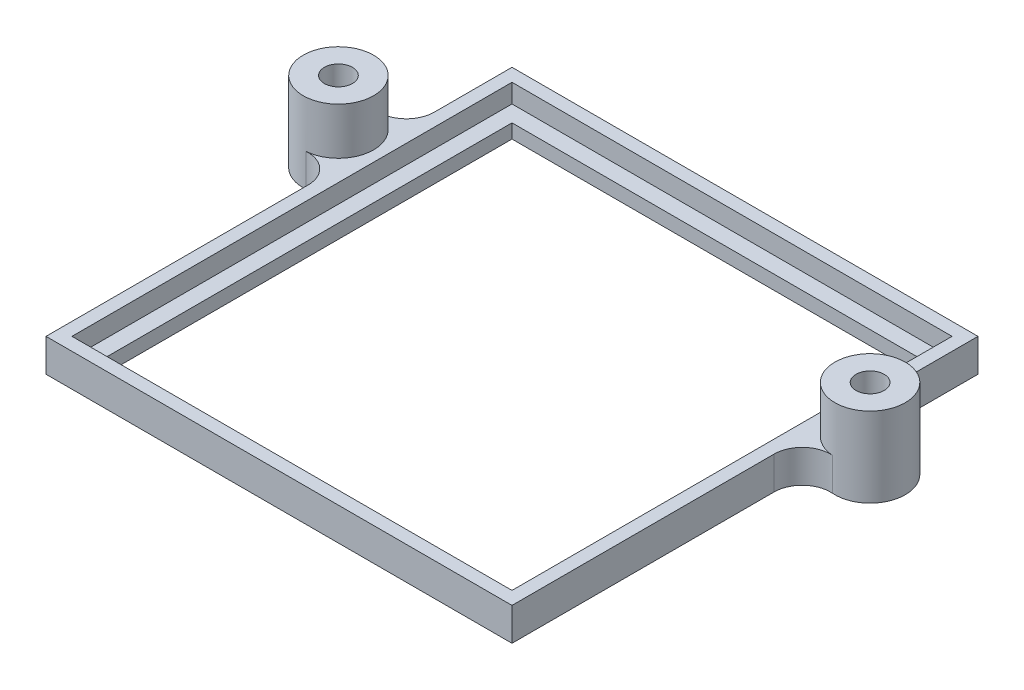
ISO-10303-21;
HEADER;
FILE_DESCRIPTION(('STEP AP214'),'2;1');
FILE_NAME('part.step','',(''),(''),'','','');
FILE_SCHEMA(('AUTOMOTIVE_DESIGN { 1 0 10303 214 1 1 1 1 }'));
ENDSEC;
DATA;
#1=APPLICATION_CONTEXT('core data for automotive mechanical design processes');
#2=APPLICATION_PROTOCOL_DEFINITION('international standard','automotive_design',2000,#1);
#3=PRODUCT_CONTEXT('',#1,'mechanical');
#4=PRODUCT('Part','Part','',(#3));
#5=PRODUCT_RELATED_PRODUCT_CATEGORY('part','',(#4));
#6=PRODUCT_DEFINITION_FORMATION('','',#4);
#7=PRODUCT_DEFINITION_CONTEXT('part definition',#1,'design');
#8=PRODUCT_DEFINITION('design','',#6,#7);
#9=PRODUCT_DEFINITION_SHAPE('','',#8);
#10=(LENGTH_UNIT() NAMED_UNIT(*) SI_UNIT(.MILLI.,.METRE.));
#11=(NAMED_UNIT(*) PLANE_ANGLE_UNIT() SI_UNIT($,.RADIAN.));
#12=(NAMED_UNIT(*) SI_UNIT($,.STERADIAN.) SOLID_ANGLE_UNIT());
#13=UNCERTAINTY_MEASURE_WITH_UNIT(LENGTH_MEASURE(1.E-05),#10,'distance_accuracy_value','');
#14=(GEOMETRIC_REPRESENTATION_CONTEXT(3) GLOBAL_UNCERTAINTY_ASSIGNED_CONTEXT((#13)) GLOBAL_UNIT_ASSIGNED_CONTEXT((#10,
#11,#12)) REPRESENTATION_CONTEXT('',''));
#15=CARTESIAN_POINT('',(0.,0.,0.));
#16=DIRECTION('',(0.,0.,1.));
#17=DIRECTION('',(1.,0.,0.));
#18=AXIS2_PLACEMENT_3D('',#15,#16,#17);
#19=CARTESIAN_POINT('',(24.8321403722642,3.5,0.));
#20=DIRECTION('',(-1.,0.,0.));
#21=DIRECTION('',(0.,0.,1.));
#22=AXIS2_PLACEMENT_3D('',#19,#20,#21);
#23=PLANE('',#22);
#24=DIRECTION('',(0.,0.,-1.));
#25=VECTOR('',#24,1.);
#26=CARTESIAN_POINT('',(24.8321403722642,0.,0.));
#27=LINE('',#26,#25);
#28=CARTESIAN_POINT('',(24.8321403722642,0.,24.8321403722642));
#29=VERTEX_POINT('',#28);
#30=CARTESIAN_POINT('',(24.8321403722642,0.,-3.10068436334608));
#31=VERTEX_POINT('',#30);
#32=EDGE_CURVE('E223',#29,#31,#27,.T.);
#33=ORIENTED_EDGE('',*,*,#32,.T.);
#34=DIRECTION('',(0.,1.,0.));
#35=VECTOR('',#34,1.);
#36=CARTESIAN_POINT('',(24.8321403722642,3.5,-3.10068436334608));
#37=LINE('',#36,#35);
#38=CARTESIAN_POINT('',(24.8321403722642,3.5,-3.10068436334608));
#39=VERTEX_POINT('',#38);
#40=EDGE_CURVE('E307',#31,#39,#37,.T.);
#41=ORIENTED_EDGE('',*,*,#40,.T.);
#42=DIRECTION('',(0.,0.,-1.));
#43=VECTOR('',#42,1.);
#44=CARTESIAN_POINT('',(24.8321403722642,3.5,0.));
#45=LINE('',#44,#43);
#46=CARTESIAN_POINT('',(24.8321403722642,3.5,24.8321403722642));
#47=VERTEX_POINT('',#46);
#48=EDGE_CURVE('E207',#47,#39,#45,.T.);
#49=ORIENTED_EDGE('',*,*,#48,.F.);
#50=DIRECTION('',(0.,-1.,0.));
#51=VECTOR('',#50,1.);
#52=CARTESIAN_POINT('',(24.8321403722642,3.5,24.8321403722642));
#53=LINE('',#52,#51);
#54=EDGE_CURVE('E238',#47,#29,#53,.T.);
#55=ORIENTED_EDGE('',*,*,#54,.T.);
#56=EDGE_LOOP('',(#33,#41,#49,#55));
#57=FACE_BOUND('',#56,.T.);
#58=ADVANCED_FACE('F35',(#57),#23,.F.);
#59=CARTESIAN_POINT('',(-24.8321403722642,3.5,0.));
#60=DIRECTION('',(-1.,0.,0.));
#61=DIRECTION('',(0.,0.,1.));
#62=AXIS2_PLACEMENT_3D('',#59,#60,#61);
#63=PLANE('',#62);
#64=DIRECTION('',(0.,0.,-1.));
#65=VECTOR('',#64,1.);
#66=CARTESIAN_POINT('',(-24.8321403722642,3.5,0.));
#67=LINE('',#66,#65);
#68=CARTESIAN_POINT('',(-24.8321403722642,3.5,24.8321403722642));
#69=VERTEX_POINT('',#68);
#70=CARTESIAN_POINT('',(-24.8321403722642,3.5,-3.10068436334608));
#71=VERTEX_POINT('',#70);
#72=EDGE_CURVE('E214',#69,#71,#67,.T.);
#73=ORIENTED_EDGE('',*,*,#72,.T.);
#74=DIRECTION('',(0.,-1.,0.));
#75=VECTOR('',#74,1.);
#76=CARTESIAN_POINT('',(-24.8321403722642,0.,-3.10068436334608));
#77=LINE('',#76,#75);
#78=CARTESIAN_POINT('',(-24.8321403722642,0.,-3.10068436334608));
#79=VERTEX_POINT('',#78);
#80=EDGE_CURVE('E295',#71,#79,#77,.T.);
#81=ORIENTED_EDGE('',*,*,#80,.T.);
#82=DIRECTION('',(0.,0.,-1.));
#83=VECTOR('',#82,1.);
#84=CARTESIAN_POINT('',(-24.8321403722642,0.,0.));
#85=LINE('',#84,#83);
#86=CARTESIAN_POINT('',(-24.8321403722642,0.,24.8321403722642));
#87=VERTEX_POINT('',#86);
#88=EDGE_CURVE('E192',#87,#79,#85,.T.);
#89=ORIENTED_EDGE('',*,*,#88,.F.);
#90=DIRECTION('',(0.,-1.,0.));
#91=VECTOR('',#90,1.);
#92=CARTESIAN_POINT('',(-24.8321403722642,3.5,24.8321403722642));
#93=LINE('',#92,#91);
#94=EDGE_CURVE('E182',#69,#87,#93,.T.);
#95=ORIENTED_EDGE('',*,*,#94,.F.);
#96=EDGE_LOOP('',(#73,#81,#89,#95));
#97=FACE_BOUND('',#96,.T.);
#98=ADVANCED_FACE('F380',(#97),#63,.T.);
#99=CARTESIAN_POINT('',(21.7061491935484,1.5,0.));
#100=DIRECTION('',(-1.,0.,0.));
#101=DIRECTION('',(0.,0.,1.));
#102=AXIS2_PLACEMENT_3D('',#99,#100,#101);
#103=PLANE('',#102);
#104=DIRECTION('',(0.,0.,-1.));
#105=VECTOR('',#104,1.);
#106=CARTESIAN_POINT('',(21.7061491935484,0.,0.));
#107=LINE('',#106,#105);
#108=CARTESIAN_POINT('',(21.7061491935484,0.,21.7061491935484));
#109=VERTEX_POINT('',#108);
#110=CARTESIAN_POINT('',(21.7061491935484,0.,-21.7061491935484));
#111=VERTEX_POINT('',#110);
#112=EDGE_CURVE('E241',#109,#111,#107,.T.);
#113=ORIENTED_EDGE('',*,*,#112,.F.);
#114=DIRECTION('',(0.,-1.,0.));
#115=VECTOR('',#114,1.);
#116=CARTESIAN_POINT('',(21.7061491935484,1.5,21.7061491935484));
#117=LINE('',#116,#115);
#118=CARTESIAN_POINT('',(21.7061491935484,1.5,21.7061491935484));
#119=VERTEX_POINT('',#118);
#120=EDGE_CURVE('E283',#119,#109,#117,.T.);
#121=ORIENTED_EDGE('',*,*,#120,.F.);
#122=DIRECTION('',(0.,0.,-1.));
#123=VECTOR('',#122,1.);
#124=CARTESIAN_POINT('',(21.7061491935484,1.5,0.));
#125=LINE('',#124,#123);
#126=CARTESIAN_POINT('',(21.7061491935484,1.5,-21.7061491935484));
#127=VERTEX_POINT('',#126);
#128=EDGE_CURVE('E247',#119,#127,#125,.T.);
#129=ORIENTED_EDGE('',*,*,#128,.T.);
#130=DIRECTION('',(0.,-1.,0.));
#131=VECTOR('',#130,1.);
#132=CARTESIAN_POINT('',(21.7061491935484,1.5,-21.7061491935484));
#133=LINE('',#132,#131);
#134=EDGE_CURVE('E267',#127,#111,#133,.T.);
#135=ORIENTED_EDGE('',*,*,#134,.T.);
#136=EDGE_LOOP('',(#113,#121,#129,#135));
#137=FACE_BOUND('',#136,.T.);
#138=ADVANCED_FACE('F387',(#137),#103,.T.);
#139=CARTESIAN_POINT('',(0.,1.5,21.7061491935484));
#140=DIRECTION('',(0.,0.,-1.));
#141=DIRECTION('',(-1.,0.,0.));
#142=AXIS2_PLACEMENT_3D('',#139,#140,#141);
#143=PLANE('',#142);
#144=DIRECTION('',(1.,0.,0.));
#145=VECTOR('',#144,1.);
#146=CARTESIAN_POINT('',(0.,0.,21.7061491935484));
#147=LINE('',#146,#145);
#148=CARTESIAN_POINT('',(-21.7061491935484,0.,21.7061491935484));
#149=VERTEX_POINT('',#148);
#150=EDGE_CURVE('E270',#149,#109,#147,.T.);
#151=ORIENTED_EDGE('',*,*,#150,.F.);
#152=DIRECTION('',(0.,-1.,0.));
#153=VECTOR('',#152,1.);
#154=CARTESIAN_POINT('',(-21.7061491935484,1.5,21.7061491935484));
#155=LINE('',#154,#153);
#156=CARTESIAN_POINT('',(-21.7061491935484,1.5,21.7061491935484));
#157=VERTEX_POINT('',#156);
#158=EDGE_CURVE('E281',#157,#149,#155,.T.);
#159=ORIENTED_EDGE('',*,*,#158,.F.);
#160=DIRECTION('',(1.,0.,0.));
#161=VECTOR('',#160,1.);
#162=CARTESIAN_POINT('',(0.,1.5,21.7061491935484));
#163=LINE('',#162,#161);
#164=EDGE_CURVE('E250',#157,#119,#163,.T.);
#165=ORIENTED_EDGE('',*,*,#164,.T.);
#166=ORIENTED_EDGE('',*,*,#120,.T.);
#167=EDGE_LOOP('',(#151,#159,#165,#166));
#168=FACE_BOUND('',#167,.T.);
#169=ADVANCED_FACE('F419',(#168),#143,.T.);
#170=CARTESIAN_POINT('',(-21.7061491935484,1.5,0.));
#171=DIRECTION('',(-1.,0.,0.));
#172=DIRECTION('',(0.,0.,1.));
#173=AXIS2_PLACEMENT_3D('',#170,#171,#172);
#174=PLANE('',#173);
#175=DIRECTION('',(0.,0.,-1.));
#176=VECTOR('',#175,1.);
#177=CARTESIAN_POINT('',(-21.7061491935484,0.,0.));
#178=LINE('',#177,#176);
#179=CARTESIAN_POINT('',(-21.7061491935484,0.,-21.7061491935484));
#180=VERTEX_POINT('',#179);
#181=EDGE_CURVE('E273',#149,#180,#178,.T.);
#182=ORIENTED_EDGE('',*,*,#181,.T.);
#183=DIRECTION('',(0.,-1.,0.));
#184=VECTOR('',#183,1.);
#185=CARTESIAN_POINT('',(-21.7061491935484,1.5,-21.7061491935484));
#186=LINE('',#185,#184);
#187=CARTESIAN_POINT('',(-21.7061491935484,1.5,-21.7061491935484));
#188=VERTEX_POINT('',#187);
#189=EDGE_CURVE('E278',#188,#180,#186,.T.);
#190=ORIENTED_EDGE('',*,*,#189,.F.);
#191=DIRECTION('',(0.,0.,-1.));
#192=VECTOR('',#191,1.);
#193=CARTESIAN_POINT('',(-21.7061491935484,1.5,0.));
#194=LINE('',#193,#192);
#195=EDGE_CURVE('E254',#157,#188,#194,.T.);
#196=ORIENTED_EDGE('',*,*,#195,.F.);
#197=ORIENTED_EDGE('',*,*,#158,.T.);
#198=EDGE_LOOP('',(#182,#190,#196,#197));
#199=FACE_BOUND('',#198,.T.);
#200=ADVANCED_FACE('F423',(#199),#174,.F.);
#201=CARTESIAN_POINT('',(0.,1.5,-21.7061491935484));
#202=DIRECTION('',(0.,0.,-1.));
#203=DIRECTION('',(-1.,0.,0.));
#204=AXIS2_PLACEMENT_3D('',#201,#202,#203);
#205=PLANE('',#204);
#206=DIRECTION('',(1.,0.,0.));
#207=VECTOR('',#206,1.);
#208=CARTESIAN_POINT('',(0.,0.,-21.7061491935484));
#209=LINE('',#208,#207);
#210=EDGE_CURVE('E251',#180,#111,#209,.T.);
#211=ORIENTED_EDGE('',*,*,#210,.T.);
#212=ORIENTED_EDGE('',*,*,#134,.F.);
#213=DIRECTION('',(1.,0.,0.));
#214=VECTOR('',#213,1.);
#215=CARTESIAN_POINT('',(0.,1.5,-21.7061491935484));
#216=LINE('',#215,#214);
#217=EDGE_CURVE('E256',#188,#127,#216,.T.);
#218=ORIENTED_EDGE('',*,*,#217,.F.);
#219=ORIENTED_EDGE('',*,*,#189,.T.);
#220=EDGE_LOOP('',(#211,#212,#218,#219));
#221=FACE_BOUND('',#220,.T.);
#222=ADVANCED_FACE('F427',(#221),#205,.F.);
#223=CARTESIAN_POINT('',(0.,1.5,0.));
#224=DIRECTION('',(0.,1.,0.));
#225=DIRECTION('',(0.,0.,1.));
#226=AXIS2_PLACEMENT_3D('',#223,#224,#225);
#227=PLANE('',#226);
#228=ORIENTED_EDGE('',*,*,#128,.F.);
#229=ORIENTED_EDGE('',*,*,#164,.F.);
#230=ORIENTED_EDGE('',*,*,#195,.T.);
#231=ORIENTED_EDGE('',*,*,#217,.T.);
#232=EDGE_LOOP('',(#228,#229,#230,#231));
#233=FACE_BOUND('',#232,.T.);
#234=DIRECTION('',(1.,0.,0.));
#235=VECTOR('',#234,1.);
#236=CARTESIAN_POINT('',(0.,1.5,23.4482557319042));
#237=LINE('',#236,#235);
#238=CARTESIAN_POINT('',(-23.4482557319042,1.5,23.4482557319042));
#239=VERTEX_POINT('',#238);
#240=CARTESIAN_POINT('',(23.4482557319042,1.5,23.4482557319042));
#241=VERTEX_POINT('',#240);
#242=EDGE_CURVE('E258',#239,#241,#237,.T.);
#243=ORIENTED_EDGE('',*,*,#242,.T.);
#244=DIRECTION('',(0.,0.,-1.));
#245=VECTOR('',#244,1.);
#246=CARTESIAN_POINT('',(23.4482557319042,1.5,0.));
#247=LINE('',#246,#245);
#248=CARTESIAN_POINT('',(23.4482557319042,1.5,-23.4482557319042));
#249=VERTEX_POINT('',#248);
#250=EDGE_CURVE('E178',#241,#249,#247,.T.);
#251=ORIENTED_EDGE('',*,*,#250,.T.);
#252=DIRECTION('',(1.,0.,0.));
#253=VECTOR('',#252,1.);
#254=CARTESIAN_POINT('',(0.,1.5,-23.4482557319042));
#255=LINE('',#254,#253);
#256=CARTESIAN_POINT('',(-23.4482557319042,1.5,-23.4482557319042));
#257=VERTEX_POINT('',#256);
#258=EDGE_CURVE('E261',#257,#249,#255,.T.);
#259=ORIENTED_EDGE('',*,*,#258,.F.);
#260=DIRECTION('',(0.,0.,-1.));
#261=VECTOR('',#260,1.);
#262=CARTESIAN_POINT('',(-23.4482557319042,1.5,0.));
#263=LINE('',#262,#261);
#264=EDGE_CURVE('E264',#239,#257,#263,.T.);
#265=ORIENTED_EDGE('',*,*,#264,.F.);
#266=EDGE_LOOP('',(#243,#251,#259,#265));
#267=FACE_BOUND('',#266,.T.);
#268=ADVANCED_FACE('F356',(#233,#267),#227,.T.);
#269=CARTESIAN_POINT('',(0.,0.,0.));
#270=DIRECTION('',(0.,1.,0.));
#271=DIRECTION('',(0.,0.,1.));
#272=AXIS2_PLACEMENT_3D('',#269,#270,#271);
#273=PLANE('',#272);
#274=ORIENTED_EDGE('',*,*,#112,.T.);
#275=ORIENTED_EDGE('',*,*,#210,.F.);
#276=ORIENTED_EDGE('',*,*,#181,.F.);
#277=ORIENTED_EDGE('',*,*,#150,.T.);
#278=EDGE_LOOP('',(#274,#275,#276,#277));
#279=FACE_BOUND('',#278,.T.);
#280=CARTESIAN_POINT('',(24.8321403722642,0.,-16.5635963811823));
#281=VERTEX_POINT('',#280);
#282=CARTESIAN_POINT('',(24.8321403722642,0.,-24.8321403722642));
#283=VERTEX_POINT('',#282);
#284=EDGE_CURVE('E221',#281,#283,#27,.T.);
#285=ORIENTED_EDGE('',*,*,#284,.F.);
#286=CARTESIAN_POINT('',(27.8321403722642,0.,-16.5635963811823));
#287=DIRECTION('',(0.,1.,0.));
#288=DIRECTION('',(0.,0.,1.));
#289=AXIS2_PLACEMENT_3D('',#286,#287,#288);
#290=CIRCLE('',#289,3.);
#291=CARTESIAN_POINT('',(28.0543625944864,0.,-13.5718381549965));
#292=VERTEX_POINT('',#291);
#293=EDGE_CURVE('E318',#281,#292,#290,.T.);
#294=ORIENTED_EDGE('',*,*,#293,.T.);
#295=CARTESIAN_POINT('',(28.3321403722642,0.,-9.83214037226421));
#296=DIRECTION('',(0.,1.,0.));
#297=DIRECTION('',(0.,0.,1.));
#298=AXIS2_PLACEMENT_3D('',#295,#296,#297);
#299=CIRCLE('',#298,3.75);
#300=CARTESIAN_POINT('',(28.0543625944864,0.,-6.09244258953192));
#301=VERTEX_POINT('',#300);
#302=EDGE_CURVE('E325',#292,#301,#299,.F.);
#303=ORIENTED_EDGE('',*,*,#302,.T.);
#304=CARTESIAN_POINT('',(27.8321403722642,0.,-3.10068436334608));
#305=DIRECTION('',(0.,1.,0.));
#306=DIRECTION('',(0.,0.,1.));
#307=AXIS2_PLACEMENT_3D('',#304,#305,#306);
#308=CIRCLE('',#307,3.);
#309=EDGE_CURVE('E11',#301,#31,#308,.T.);
#310=ORIENTED_EDGE('',*,*,#309,.T.);
#311=ORIENTED_EDGE('',*,*,#32,.F.);
#312=DIRECTION('',(1.,0.,0.));
#313=VECTOR('',#312,1.);
#314=CARTESIAN_POINT('',(0.,0.,24.8321403722642));
#315=LINE('',#314,#313);
#316=EDGE_CURVE('E218',#87,#29,#315,.T.);
#317=ORIENTED_EDGE('',*,*,#316,.F.);
#318=ORIENTED_EDGE('',*,*,#88,.T.);
#319=CARTESIAN_POINT('',(-27.8321403722642,0.,-3.10068436334608));
#320=DIRECTION('',(0.,1.,0.));
#321=DIRECTION('',(0.,0.,1.));
#322=AXIS2_PLACEMENT_3D('',#319,#320,#321);
#323=CIRCLE('',#322,3.);
#324=CARTESIAN_POINT('',(-28.0543625944864,0.,-6.09244258953192));
#325=VERTEX_POINT('',#324);
#326=EDGE_CURVE('E311',#79,#325,#323,.T.);
#327=ORIENTED_EDGE('',*,*,#326,.T.);
#328=CARTESIAN_POINT('',(-28.3321403722642,0.,-9.83214037226421));
#329=DIRECTION('',(0.,1.,0.));
#330=DIRECTION('',(0.,0.,1.));
#331=AXIS2_PLACEMENT_3D('',#328,#329,#330);
#332=CIRCLE('',#331,3.75);
#333=CARTESIAN_POINT('',(-28.0543625944864,0.,-13.5718381549965));
#334=VERTEX_POINT('',#333);
#335=EDGE_CURVE('E346',#325,#334,#332,.F.);
#336=ORIENTED_EDGE('',*,*,#335,.T.);
#337=CARTESIAN_POINT('',(-27.8321403722642,0.,-16.5635963811823));
#338=DIRECTION('',(0.,1.,0.));
#339=DIRECTION('',(0.,0.,1.));
#340=AXIS2_PLACEMENT_3D('',#337,#338,#339);
#341=CIRCLE('',#340,3.);
#342=CARTESIAN_POINT('',(-24.8321403722642,0.,-16.5635963811823));
#343=VERTEX_POINT('',#342);
#344=EDGE_CURVE('E313',#334,#343,#341,.T.);
#345=ORIENTED_EDGE('',*,*,#344,.T.);
#346=CARTESIAN_POINT('',(-24.8321403722642,0.,-24.8321403722642));
#347=VERTEX_POINT('',#346);
#348=EDGE_CURVE('E228',#343,#347,#85,.T.);
#349=ORIENTED_EDGE('',*,*,#348,.T.);
#350=DIRECTION('',(1.,0.,0.));
#351=VECTOR('',#350,1.);
#352=CARTESIAN_POINT('',(0.,0.,-24.8321403722642));
#353=LINE('',#352,#351);
#354=EDGE_CURVE('E225',#347,#283,#353,.T.);
#355=ORIENTED_EDGE('',*,*,#354,.T.);
#356=EDGE_LOOP('',(#285,#294,#303,#310,#311,#317,#318,#327,#336,#345,#349,#355));
#357=FACE_BOUND('',#356,.T.);
#358=CARTESIAN_POINT('',(-28.3321403722642,0.,-9.83214037226421));
#359=DIRECTION('',(0.,1.,0.));
#360=DIRECTION('',(0.,0.,1.));
#361=AXIS2_PLACEMENT_3D('',#358,#359,#360);
#362=CIRCLE('',#361,1.5);
#363=CARTESIAN_POINT('',(-28.3321403722642,0.,-8.33214037226421));
#364=VERTEX_POINT('',#363);
#365=EDGE_CURVE('E222',#364,#364,#362,.F.);
#366=ORIENTED_EDGE('',*,*,#365,.F.);
#367=EDGE_LOOP('',(#366));
#368=FACE_BOUND('',#367,.T.);
#369=CARTESIAN_POINT('',(28.3321403722642,0.,-9.83214037226421));
#370=DIRECTION('',(0.,1.,0.));
#371=DIRECTION('',(0.,0.,1.));
#372=AXIS2_PLACEMENT_3D('',#369,#370,#371);
#373=CIRCLE('',#372,1.5);
#374=CARTESIAN_POINT('',(28.3321403722642,0.,-8.33214037226421));
#375=VERTEX_POINT('',#374);
#376=EDGE_CURVE('E330',#375,#375,#373,.F.);
#377=ORIENTED_EDGE('',*,*,#376,.F.);
#378=EDGE_LOOP('',(#377));
#379=FACE_BOUND('',#378,.T.);
#380=ADVANCED_FACE('F328',(#279,#357,#368,#379),#273,.F.);
#381=CARTESIAN_POINT('',(0.,3.5,24.8321403722642));
#382=DIRECTION('',(0.,0.,-1.));
#383=DIRECTION('',(-1.,0.,0.));
#384=AXIS2_PLACEMENT_3D('',#381,#382,#383);
#385=PLANE('',#384);
#386=ORIENTED_EDGE('',*,*,#316,.T.);
#387=ORIENTED_EDGE('',*,*,#54,.F.);
#388=DIRECTION('',(1.,0.,0.));
#389=VECTOR('',#388,1.);
#390=CARTESIAN_POINT('',(0.,3.5,24.8321403722642));
#391=LINE('',#390,#389);
#392=EDGE_CURVE('E203',#69,#47,#391,.T.);
#393=ORIENTED_EDGE('',*,*,#392,.F.);
#394=ORIENTED_EDGE('',*,*,#94,.T.);
#395=EDGE_LOOP('',(#386,#387,#393,#394));
#396=FACE_BOUND('',#395,.T.);
#397=ADVANCED_FACE('F355',(#396),#385,.F.);
#398=CARTESIAN_POINT('',(24.8321403722642,3.5,-16.5635963811823));
#399=VERTEX_POINT('',#398);
#400=CARTESIAN_POINT('',(24.8321403722642,3.5,-24.8321403722642));
#401=VERTEX_POINT('',#400);
#402=EDGE_CURVE('E206',#399,#401,#45,.T.);
#403=ORIENTED_EDGE('',*,*,#402,.F.);
#404=DIRECTION('',(0.,1.,0.));
#405=VECTOR('',#404,1.);
#406=CARTESIAN_POINT('',(24.8321403722642,3.5,-16.5635963811823));
#407=LINE('',#406,#405);
#408=EDGE_CURVE('E299',#399,#281,#407,.F.);
#409=ORIENTED_EDGE('',*,*,#408,.T.);
#410=ORIENTED_EDGE('',*,*,#284,.T.);
#411=DIRECTION('',(0.,-1.,0.));
#412=VECTOR('',#411,1.);
#413=CARTESIAN_POINT('',(24.8321403722642,3.5,-24.8321403722642));
#414=LINE('',#413,#412);
#415=EDGE_CURVE('E235',#401,#283,#414,.T.);
#416=ORIENTED_EDGE('',*,*,#415,.F.);
#417=EDGE_LOOP('',(#403,#409,#410,#416));
#418=FACE_BOUND('',#417,.T.);
#419=ADVANCED_FACE('F383',(#418),#23,.F.);
#420=CARTESIAN_POINT('',(0.,3.5,-24.8321403722642));
#421=DIRECTION('',(0.,0.,-1.));
#422=DIRECTION('',(-1.,0.,0.));
#423=AXIS2_PLACEMENT_3D('',#420,#421,#422);
#424=PLANE('',#423);
#425=ORIENTED_EDGE('',*,*,#354,.F.);
#426=DIRECTION('',(0.,-1.,0.));
#427=VECTOR('',#426,1.);
#428=CARTESIAN_POINT('',(-24.8321403722642,3.5,-24.8321403722642));
#429=LINE('',#428,#427);
#430=CARTESIAN_POINT('',(-24.8321403722642,3.5,-24.8321403722642));
#431=VERTEX_POINT('',#430);
#432=EDGE_CURVE('E232',#431,#347,#429,.T.);
#433=ORIENTED_EDGE('',*,*,#432,.F.);
#434=DIRECTION('',(1.,0.,0.));
#435=VECTOR('',#434,1.);
#436=CARTESIAN_POINT('',(0.,3.5,-24.8321403722642));
#437=LINE('',#436,#435);
#438=EDGE_CURVE('E210',#431,#401,#437,.T.);
#439=ORIENTED_EDGE('',*,*,#438,.T.);
#440=ORIENTED_EDGE('',*,*,#415,.T.);
#441=EDGE_LOOP('',(#425,#433,#439,#440));
#442=FACE_BOUND('',#441,.T.);
#443=ADVANCED_FACE('F394',(#442),#424,.T.);
#444=CARTESIAN_POINT('',(23.4482557319042,3.5,0.));
#445=DIRECTION('',(-1.,0.,0.));
#446=DIRECTION('',(0.,0.,1.));
#447=AXIS2_PLACEMENT_3D('',#444,#445,#446);
#448=PLANE('',#447);
#449=DIRECTION('',(0.,-1.,0.));
#450=VECTOR('',#449,1.);
#451=CARTESIAN_POINT('',(23.4482557319042,3.5,-23.4482557319042));
#452=LINE('',#451,#450);
#453=CARTESIAN_POINT('',(23.4482557319042,3.5,-23.4482557319042));
#454=VERTEX_POINT('',#453);
#455=EDGE_CURVE('E217',#454,#249,#452,.T.);
#456=ORIENTED_EDGE('',*,*,#455,.T.);
#457=ORIENTED_EDGE('',*,*,#250,.F.);
#458=DIRECTION('',(0.,-1.,0.));
#459=VECTOR('',#458,1.);
#460=CARTESIAN_POINT('',(23.4482557319042,3.5,23.4482557319042));
#461=LINE('',#460,#459);
#462=CARTESIAN_POINT('',(23.4482557319042,3.5,23.4482557319042));
#463=VERTEX_POINT('',#462);
#464=EDGE_CURVE('E173',#463,#241,#461,.T.);
#465=ORIENTED_EDGE('',*,*,#464,.F.);
#466=DIRECTION('',(0.,0.,-1.));
#467=VECTOR('',#466,1.);
#468=CARTESIAN_POINT('',(23.4482557319042,3.5,0.));
#469=LINE('',#468,#467);
#470=EDGE_CURVE('E177',#463,#454,#469,.T.);
#471=ORIENTED_EDGE('',*,*,#470,.T.);
#472=EDGE_LOOP('',(#456,#457,#465,#471));
#473=FACE_BOUND('',#472,.T.);
#474=ADVANCED_FACE('F176',(#473),#448,.T.);
#475=CARTESIAN_POINT('',(0.,3.5,23.4482557319042));
#476=DIRECTION('',(0.,0.,-1.));
#477=DIRECTION('',(-1.,0.,0.));
#478=AXIS2_PLACEMENT_3D('',#475,#476,#477);
#479=PLANE('',#478);
#480=ORIENTED_EDGE('',*,*,#464,.T.);
#481=ORIENTED_EDGE('',*,*,#242,.F.);
#482=DIRECTION('',(0.,-1.,0.));
#483=VECTOR('',#482,1.);
#484=CARTESIAN_POINT('',(-23.4482557319042,3.5,23.4482557319042));
#485=LINE('',#484,#483);
#486=CARTESIAN_POINT('',(-23.4482557319042,3.5,23.4482557319042));
#487=VERTEX_POINT('',#486);
#488=EDGE_CURVE('E183',#487,#239,#485,.T.);
#489=ORIENTED_EDGE('',*,*,#488,.F.);
#490=DIRECTION('',(1.,0.,0.));
#491=VECTOR('',#490,1.);
#492=CARTESIAN_POINT('',(0.,3.5,23.4482557319042));
#493=LINE('',#492,#491);
#494=EDGE_CURVE('E188',#487,#463,#493,.T.);
#495=ORIENTED_EDGE('',*,*,#494,.T.);
#496=EDGE_LOOP('',(#480,#481,#489,#495));
#497=FACE_BOUND('',#496,.T.);
#498=ADVANCED_FACE('F194',(#497),#479,.T.);
#499=CARTESIAN_POINT('',(-23.4482557319042,3.5,0.));
#500=DIRECTION('',(-1.,0.,0.));
#501=DIRECTION('',(0.,0.,1.));
#502=AXIS2_PLACEMENT_3D('',#499,#500,#501);
#503=PLANE('',#502);
#504=ORIENTED_EDGE('',*,*,#264,.T.);
#505=DIRECTION('',(0.,-1.,0.));
#506=VECTOR('',#505,1.);
#507=CARTESIAN_POINT('',(-23.4482557319042,3.5,-23.4482557319042));
#508=LINE('',#507,#506);
#509=CARTESIAN_POINT('',(-23.4482557319042,3.5,-23.4482557319042));
#510=VERTEX_POINT('',#509);
#511=EDGE_CURVE('E243',#510,#257,#508,.T.);
#512=ORIENTED_EDGE('',*,*,#511,.F.);
#513=DIRECTION('',(0.,0.,-1.));
#514=VECTOR('',#513,1.);
#515=CARTESIAN_POINT('',(-23.4482557319042,3.5,0.));
#516=LINE('',#515,#514);
#517=EDGE_CURVE('E197',#487,#510,#516,.T.);
#518=ORIENTED_EDGE('',*,*,#517,.F.);
#519=ORIENTED_EDGE('',*,*,#488,.T.);
#520=EDGE_LOOP('',(#504,#512,#518,#519));
#521=FACE_BOUND('',#520,.T.);
#522=ADVANCED_FACE('F439',(#521),#503,.F.);
#523=CARTESIAN_POINT('',(0.,3.5,-23.4482557319042));
#524=DIRECTION('',(0.,0.,-1.));
#525=DIRECTION('',(-1.,0.,0.));
#526=AXIS2_PLACEMENT_3D('',#523,#524,#525);
#527=PLANE('',#526);
#528=ORIENTED_EDGE('',*,*,#258,.T.);
#529=ORIENTED_EDGE('',*,*,#455,.F.);
#530=DIRECTION('',(1.,0.,0.));
#531=VECTOR('',#530,1.);
#532=CARTESIAN_POINT('',(0.,3.5,-23.4482557319042));
#533=LINE('',#532,#531);
#534=EDGE_CURVE('E190',#510,#454,#533,.T.);
#535=ORIENTED_EDGE('',*,*,#534,.F.);
#536=ORIENTED_EDGE('',*,*,#511,.T.);
#537=EDGE_LOOP('',(#528,#529,#535,#536));
#538=FACE_BOUND('',#537,.T.);
#539=ADVANCED_FACE('F442',(#538),#527,.F.);
#540=ORIENTED_EDGE('',*,*,#348,.F.);
#541=DIRECTION('',(0.,-1.,0.));
#542=VECTOR('',#541,1.);
#543=CARTESIAN_POINT('',(-24.8321403722642,3.5,-16.5635963811823));
#544=LINE('',#543,#542);
#545=CARTESIAN_POINT('',(-24.8321403722642,3.5,-16.5635963811823));
#546=VERTEX_POINT('',#545);
#547=EDGE_CURVE('E297',#343,#546,#544,.F.);
#548=ORIENTED_EDGE('',*,*,#547,.T.);
#549=EDGE_CURVE('E213',#546,#431,#67,.T.);
#550=ORIENTED_EDGE('',*,*,#549,.T.);
#551=ORIENTED_EDGE('',*,*,#432,.T.);
#552=EDGE_LOOP('',(#540,#548,#550,#551));
#553=FACE_BOUND('',#552,.T.);
#554=ADVANCED_FACE('F390',(#553),#63,.T.);
#555=CARTESIAN_POINT('',(0.,3.5,0.));
#556=DIRECTION('',(0.,1.,0.));
#557=DIRECTION('',(0.,0.,1.));
#558=AXIS2_PLACEMENT_3D('',#555,#556,#557);
#559=PLANE('',#558);
#560=CARTESIAN_POINT('',(28.3321403722642,3.5,-9.83214037226421));
#561=DIRECTION('',(0.,1.,0.));
#562=DIRECTION('',(0.,0.,1.));
#563=AXIS2_PLACEMENT_3D('',#560,#561,#562);
#564=CIRCLE('',#563,3.75);
#565=CARTESIAN_POINT('',(28.0543625944864,3.5,-13.5718381549965));
#566=VERTEX_POINT('',#565);
#567=CARTESIAN_POINT('',(28.0543625944864,3.5,-6.09244258953192));
#568=VERTEX_POINT('',#567);
#569=EDGE_CURVE('E287',#566,#568,#564,.T.);
#570=ORIENTED_EDGE('',*,*,#569,.F.);
#571=CARTESIAN_POINT('',(27.8321403722642,3.5,-16.5635963811823));
#572=DIRECTION('',(0.,1.,0.));
#573=DIRECTION('',(0.,0.,1.));
#574=AXIS2_PLACEMENT_3D('',#571,#572,#573);
#575=CIRCLE('',#574,3.);
#576=EDGE_CURVE('E320',#566,#399,#575,.F.);
#577=ORIENTED_EDGE('',*,*,#576,.T.);
#578=ORIENTED_EDGE('',*,*,#402,.T.);
#579=ORIENTED_EDGE('',*,*,#438,.F.);
#580=ORIENTED_EDGE('',*,*,#549,.F.);
#581=CARTESIAN_POINT('',(-27.8321403722642,3.5,-16.5635963811823));
#582=DIRECTION('',(0.,1.,0.));
#583=DIRECTION('',(0.,0.,1.));
#584=AXIS2_PLACEMENT_3D('',#581,#582,#583);
#585=CIRCLE('',#584,3.);
#586=CARTESIAN_POINT('',(-28.0543625944864,3.5,-13.5718381549965));
#587=VERTEX_POINT('',#586);
#588=EDGE_CURVE('E315',#546,#587,#585,.F.);
#589=ORIENTED_EDGE('',*,*,#588,.T.);
#590=CARTESIAN_POINT('',(-28.3321403722642,3.5,-9.83214037226421));
#591=DIRECTION('',(0.,1.,0.));
#592=DIRECTION('',(0.,0.,1.));
#593=AXIS2_PLACEMENT_3D('',#590,#591,#592);
#594=CIRCLE('',#593,3.75);
#595=CARTESIAN_POINT('',(-28.0543625944864,3.5,-6.09244258953192));
#596=VERTEX_POINT('',#595);
#597=EDGE_CURVE('E285',#596,#587,#594,.T.);
#598=ORIENTED_EDGE('',*,*,#597,.F.);
#599=CARTESIAN_POINT('',(-27.8321403722642,3.5,-3.10068436334608));
#600=DIRECTION('',(0.,1.,0.));
#601=DIRECTION('',(0.,0.,1.));
#602=AXIS2_PLACEMENT_3D('',#599,#600,#601);
#603=CIRCLE('',#602,3.);
#604=EDGE_CURVE('E309',#596,#71,#603,.F.);
#605=ORIENTED_EDGE('',*,*,#604,.T.);
#606=ORIENTED_EDGE('',*,*,#72,.F.);
#607=ORIENTED_EDGE('',*,*,#392,.T.);
#608=ORIENTED_EDGE('',*,*,#48,.T.);
#609=CARTESIAN_POINT('',(27.8321403722642,3.5,-3.10068436334608));
#610=DIRECTION('',(0.,1.,0.));
#611=DIRECTION('',(0.,0.,1.));
#612=AXIS2_PLACEMENT_3D('',#609,#610,#611);
#613=CIRCLE('',#612,3.);
#614=EDGE_CURVE('E43',#39,#568,#613,.F.);
#615=ORIENTED_EDGE('',*,*,#614,.T.);
#616=EDGE_LOOP('',(#570,#577,#578,#579,#580,#589,#598,#605,#606,#607,#608,#615));
#617=FACE_BOUND('',#616,.T.);
#618=ORIENTED_EDGE('',*,*,#470,.F.);
#619=ORIENTED_EDGE('',*,*,#494,.F.);
#620=ORIENTED_EDGE('',*,*,#517,.T.);
#621=ORIENTED_EDGE('',*,*,#534,.T.);
#622=EDGE_LOOP('',(#618,#619,#620,#621));
#623=FACE_BOUND('',#622,.T.);
#624=ADVANCED_FACE('F187',(#617,#623),#559,.T.);
#625=CARTESIAN_POINT('',(-28.3321403722642,-10.6066017177982,-9.83214037226421));
#626=DIRECTION('',(0.,1.,0.));
#627=DIRECTION('',(0.,0.,1.));
#628=AXIS2_PLACEMENT_3D('',#625,#626,#627);
#629=CYLINDRICAL_SURFACE('',#628,3.75);
#630=ORIENTED_EDGE('',*,*,#335,.F.);
#631=DIRECTION('',(0.,1.,0.));
#632=VECTOR('',#631,1.);
#633=CARTESIAN_POINT('',(-28.0543625944864,-10.6066017177982,-6.09244258953192));
#634=LINE('',#633,#632);
#635=EDGE_CURVE('E292',#325,#596,#634,.T.);
#636=ORIENTED_EDGE('',*,*,#635,.T.);
#637=ORIENTED_EDGE('',*,*,#597,.T.);
#638=DIRECTION('',(0.,1.,0.));
#639=VECTOR('',#638,1.);
#640=CARTESIAN_POINT('',(-28.0543625944864,-10.6066017177982,-13.5718381549965));
#641=LINE('',#640,#639);
#642=EDGE_CURVE('E289',#587,#334,#641,.F.);
#643=ORIENTED_EDGE('',*,*,#642,.T.);
#644=EDGE_LOOP('',(#630,#636,#637,#643));
#645=FACE_BOUND('',#644,.T.);
#646=CARTESIAN_POINT('',(-28.3321403722642,8.5,-9.83214037226421));
#647=DIRECTION('',(0.,1.,0.));
#648=DIRECTION('',(0.,0.,1.));
#649=AXIS2_PLACEMENT_3D('',#646,#647,#648);
#650=CIRCLE('',#649,3.75);
#651=CARTESIAN_POINT('',(-28.3321403722642,8.5,-6.08214037226421));
#652=VERTEX_POINT('',#651);
#653=EDGE_CURVE('E343',#652,#652,#650,.T.);
#654=ORIENTED_EDGE('',*,*,#653,.F.);
#655=EDGE_LOOP('',(#654));
#656=FACE_BOUND('',#655,.T.);
#657=ADVANCED_FACE('F455',(#645,#656),#629,.T.);
#658=CARTESIAN_POINT('',(-28.3321403722642,-10.6066017177982,-9.83214037226421));
#659=DIRECTION('',(0.,1.,0.));
#660=DIRECTION('',(0.,0.,1.));
#661=AXIS2_PLACEMENT_3D('',#658,#659,#660);
#662=CYLINDRICAL_SURFACE('',#661,1.5);
#663=ORIENTED_EDGE('',*,*,#365,.T.);
#664=EDGE_LOOP('',(#663));
#665=FACE_BOUND('',#664,.T.);
#666=CARTESIAN_POINT('',(-28.3321403722642,8.5,-9.83214037226421));
#667=DIRECTION('',(0.,1.,0.));
#668=DIRECTION('',(0.,0.,1.));
#669=AXIS2_PLACEMENT_3D('',#666,#667,#668);
#670=CIRCLE('',#669,1.5);
#671=CARTESIAN_POINT('',(-28.3321403722642,8.5,-8.33214037226421));
#672=VERTEX_POINT('',#671);
#673=EDGE_CURVE('E334',#672,#672,#670,.T.);
#674=ORIENTED_EDGE('',*,*,#673,.T.);
#675=EDGE_LOOP('',(#674));
#676=FACE_BOUND('',#675,.T.);
#677=ADVANCED_FACE('F351',(#665,#676),#662,.F.);
#678=CARTESIAN_POINT('',(-28.3321403722642,8.5,-9.83214037226421));
#679=DIRECTION('',(0.,1.,0.));
#680=DIRECTION('',(0.,0.,1.));
#681=AXIS2_PLACEMENT_3D('',#678,#679,#680);
#682=PLANE('',#681);
#683=ORIENTED_EDGE('',*,*,#653,.T.);
#684=EDGE_LOOP('',(#683));
#685=FACE_BOUND('',#684,.T.);
#686=ORIENTED_EDGE('',*,*,#673,.F.);
#687=EDGE_LOOP('',(#686));
#688=FACE_BOUND('',#687,.T.);
#689=ADVANCED_FACE('F464',(#685,#688),#682,.T.);
#690=CARTESIAN_POINT('',(28.3321403722642,-10.6066017177982,-9.83214037226421));
#691=DIRECTION('',(0.,1.,0.));
#692=DIRECTION('',(0.,0.,1.));
#693=AXIS2_PLACEMENT_3D('',#690,#691,#692);
#694=CYLINDRICAL_SURFACE('',#693,3.75);
#695=CARTESIAN_POINT('',(28.3321403722642,8.5,-9.83214037226421));
#696=DIRECTION('',(0.,1.,0.));
#697=DIRECTION('',(0.,0.,-1.));
#698=AXIS2_PLACEMENT_3D('',#695,#696,#697);
#699=CIRCLE('',#698,3.75);
#700=CARTESIAN_POINT('',(28.3321403722642,8.5,-13.5821403722642));
#701=VERTEX_POINT('',#700);
#702=EDGE_CURVE('E331',#701,#701,#699,.T.);
#703=ORIENTED_EDGE('',*,*,#702,.F.);
#704=EDGE_LOOP('',(#703));
#705=FACE_BOUND('',#704,.T.);
#706=ORIENTED_EDGE('',*,*,#302,.F.);
#707=DIRECTION('',(0.,1.,0.));
#708=VECTOR('',#707,1.);
#709=CARTESIAN_POINT('',(28.0543625944864,-10.6066017177982,-13.5718381549965));
#710=LINE('',#709,#708);
#711=EDGE_CURVE('E304',#292,#566,#710,.T.);
#712=ORIENTED_EDGE('',*,*,#711,.T.);
#713=ORIENTED_EDGE('',*,*,#569,.T.);
#714=DIRECTION('',(0.,1.,0.));
#715=VECTOR('',#714,1.);
#716=CARTESIAN_POINT('',(28.0543625944864,-10.6066017177982,-6.09244258953192));
#717=LINE('',#716,#715);
#718=EDGE_CURVE('E302',#568,#301,#717,.F.);
#719=ORIENTED_EDGE('',*,*,#718,.T.);
#720=EDGE_LOOP('',(#706,#712,#713,#719));
#721=FACE_BOUND('',#720,.T.);
#722=ADVANCED_FACE('F324',(#705,#721),#694,.T.);
#723=CARTESIAN_POINT('',(28.3321403722642,-10.6066017177982,-9.83214037226421));
#724=DIRECTION('',(0.,1.,0.));
#725=DIRECTION('',(0.,0.,1.));
#726=AXIS2_PLACEMENT_3D('',#723,#724,#725);
#727=CYLINDRICAL_SURFACE('',#726,1.5);
#728=ORIENTED_EDGE('',*,*,#376,.T.);
#729=EDGE_LOOP('',(#728));
#730=FACE_BOUND('',#729,.T.);
#731=CARTESIAN_POINT('',(28.3321403722642,8.5,-9.83214037226421));
#732=DIRECTION('',(0.,1.,0.));
#733=DIRECTION('',(0.,0.,-1.));
#734=AXIS2_PLACEMENT_3D('',#731,#732,#733);
#735=CIRCLE('',#734,1.5);
#736=CARTESIAN_POINT('',(28.3321403722642,8.5,-11.3321403722642));
#737=VERTEX_POINT('',#736);
#738=EDGE_CURVE('E337',#737,#737,#735,.T.);
#739=ORIENTED_EDGE('',*,*,#738,.T.);
#740=EDGE_LOOP('',(#739));
#741=FACE_BOUND('',#740,.T.);
#742=ADVANCED_FACE('F361',(#730,#741),#727,.F.);
#743=CARTESIAN_POINT('',(28.3321403722642,8.5,-9.83214037226421));
#744=DIRECTION('',(0.,-1.,0.));
#745=DIRECTION('',(0.,0.,-1.));
#746=AXIS2_PLACEMENT_3D('',#743,#744,#745);
#747=PLANE('',#746);
#748=ORIENTED_EDGE('',*,*,#702,.T.);
#749=EDGE_LOOP('',(#748));
#750=FACE_BOUND('',#749,.T.);
#751=ORIENTED_EDGE('',*,*,#738,.F.);
#752=EDGE_LOOP('',(#751));
#753=FACE_BOUND('',#752,.T.);
#754=ADVANCED_FACE('F364',(#750,#753),#747,.F.);
#755=CARTESIAN_POINT('',(-27.8321403722642,-10.6066017177982,-3.10068436334608));
#756=DIRECTION('',(0.,1.,0.));
#757=DIRECTION('',(0.,0.,1.));
#758=AXIS2_PLACEMENT_3D('',#755,#756,#757);
#759=CYLINDRICAL_SURFACE('',#758,3.);
#760=ORIENTED_EDGE('',*,*,#326,.F.);
#761=ORIENTED_EDGE('',*,*,#80,.F.);
#762=ORIENTED_EDGE('',*,*,#604,.F.);
#763=ORIENTED_EDGE('',*,*,#635,.F.);
#764=EDGE_LOOP('',(#760,#761,#762,#763));
#765=FACE_BOUND('',#764,.T.);
#766=ADVANCED_FACE('F370',(#765),#759,.F.);
#767=CARTESIAN_POINT('',(-27.8321403722642,-10.6066017177982,-16.5635963811823));
#768=DIRECTION('',(0.,1.,0.));
#769=DIRECTION('',(0.,0.,1.));
#770=AXIS2_PLACEMENT_3D('',#767,#768,#769);
#771=CYLINDRICAL_SURFACE('',#770,3.);
#772=ORIENTED_EDGE('',*,*,#588,.F.);
#773=ORIENTED_EDGE('',*,*,#547,.F.);
#774=ORIENTED_EDGE('',*,*,#344,.F.);
#775=ORIENTED_EDGE('',*,*,#642,.F.);
#776=EDGE_LOOP('',(#772,#773,#774,#775));
#777=FACE_BOUND('',#776,.T.);
#778=ADVANCED_FACE('F376',(#777),#771,.F.);
#779=CARTESIAN_POINT('',(27.8321403722642,-10.6066017177982,-16.5635963811823));
#780=DIRECTION('',(0.,1.,0.));
#781=DIRECTION('',(0.,0.,1.));
#782=AXIS2_PLACEMENT_3D('',#779,#780,#781);
#783=CYLINDRICAL_SURFACE('',#782,3.);
#784=ORIENTED_EDGE('',*,*,#576,.F.);
#785=ORIENTED_EDGE('',*,*,#711,.F.);
#786=ORIENTED_EDGE('',*,*,#293,.F.);
#787=ORIENTED_EDGE('',*,*,#408,.F.);
#788=EDGE_LOOP('',(#784,#785,#786,#787));
#789=FACE_BOUND('',#788,.T.);
#790=ADVANCED_FACE('F408',(#789),#783,.F.);
#791=CARTESIAN_POINT('',(27.8321403722642,-10.6066017177982,-3.10068436334608));
#792=DIRECTION('',(0.,1.,0.));
#793=DIRECTION('',(0.,0.,1.));
#794=AXIS2_PLACEMENT_3D('',#791,#792,#793);
#795=CYLINDRICAL_SURFACE('',#794,3.);
#796=ORIENTED_EDGE('',*,*,#309,.F.);
#797=ORIENTED_EDGE('',*,*,#718,.F.);
#798=ORIENTED_EDGE('',*,*,#614,.F.);
#799=ORIENTED_EDGE('',*,*,#40,.F.);
#800=EDGE_LOOP('',(#796,#797,#798,#799));
#801=FACE_BOUND('',#800,.T.);
#802=ADVANCED_FACE('F37',(#801),#795,.F.);
#803=CLOSED_SHELL('',(#58,#98,#138,#169,#200,#222,#268,#380,#397,#419,#443,#474,#498,#522,#539,
#554,#624,#657,#677,#689,#722,#742,#754,#766,#778,#790,#802));
#804=MANIFOLD_SOLID_BREP('B2',#803);
#805=ADVANCED_BREP_SHAPE_REPRESENTATION('',(#18,#804),#14);
#806=SHAPE_DEFINITION_REPRESENTATION(#9,#805);
ENDSEC;
END-ISO-10303-21;
